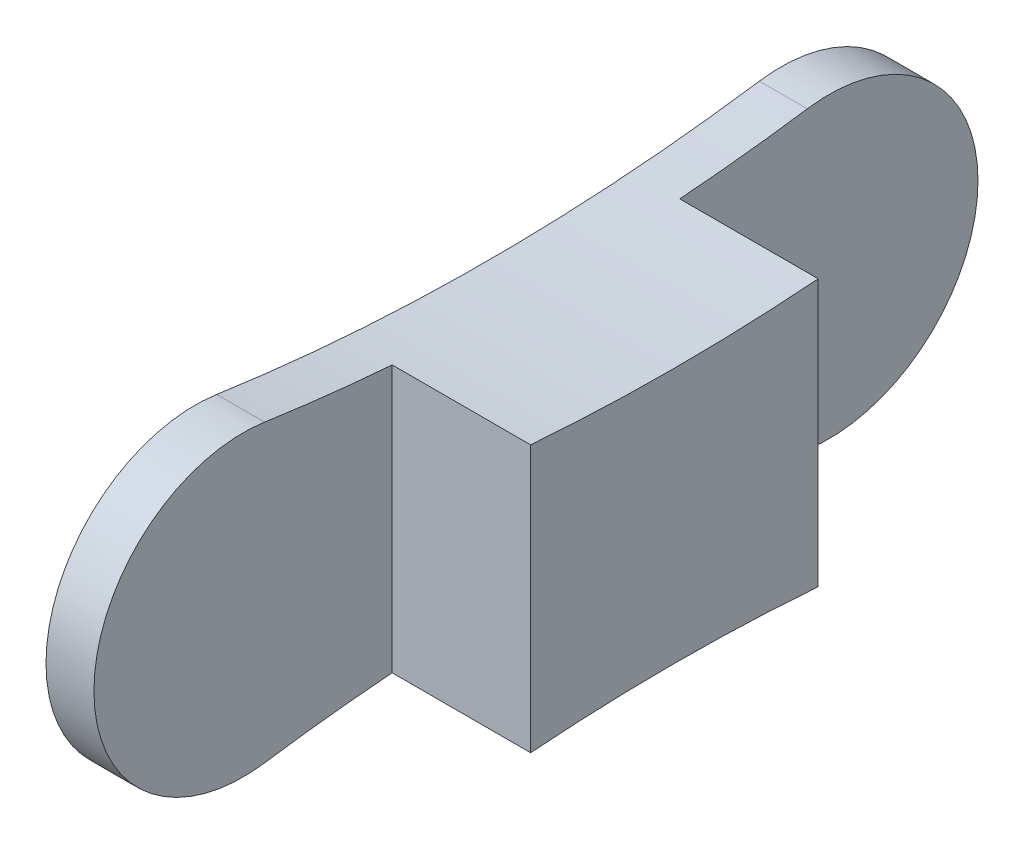
ISO-10303-21;
HEADER;
FILE_DESCRIPTION(('STEP AP214'),'2;1');
FILE_NAME('part.step','',(''),(''),'','','');
FILE_SCHEMA(('AUTOMOTIVE_DESIGN { 1 0 10303 214 1 1 1 1 }'));
ENDSEC;
DATA;
#1=APPLICATION_CONTEXT('core data for automotive mechanical design processes');
#2=APPLICATION_PROTOCOL_DEFINITION('international standard','automotive_design',2000,#1);
#3=PRODUCT_CONTEXT('',#1,'mechanical');
#4=PRODUCT('Part','Part','',(#3));
#5=PRODUCT_RELATED_PRODUCT_CATEGORY('part','',(#4));
#6=PRODUCT_DEFINITION_FORMATION('','',#4);
#7=PRODUCT_DEFINITION_CONTEXT('part definition',#1,'design');
#8=PRODUCT_DEFINITION('design','',#6,#7);
#9=PRODUCT_DEFINITION_SHAPE('','',#8);
#10=(LENGTH_UNIT() NAMED_UNIT(*) SI_UNIT(.MILLI.,.METRE.));
#11=(NAMED_UNIT(*) PLANE_ANGLE_UNIT() SI_UNIT($,.RADIAN.));
#12=(NAMED_UNIT(*) SI_UNIT($,.STERADIAN.) SOLID_ANGLE_UNIT());
#13=UNCERTAINTY_MEASURE_WITH_UNIT(LENGTH_MEASURE(1.E-05),#10,'distance_accuracy_value','');
#14=(GEOMETRIC_REPRESENTATION_CONTEXT(3) GLOBAL_UNCERTAINTY_ASSIGNED_CONTEXT((#13)) GLOBAL_UNIT_ASSIGNED_CONTEXT((#10,
#11,#12)) REPRESENTATION_CONTEXT('',''));
#15=CARTESIAN_POINT('',(0.,0.,0.));
#16=DIRECTION('',(0.,0.,1.));
#17=DIRECTION('',(1.,0.,0.));
#18=AXIS2_PLACEMENT_3D('',#15,#16,#17);
#19=CARTESIAN_POINT('',(35.,0.,0.));
#20=DIRECTION('',(-1.,0.,0.));
#21=DIRECTION('',(0.,0.,1.));
#22=AXIS2_PLACEMENT_3D('',#19,#20,#21);
#23=CYLINDRICAL_SURFACE('',#22,28.);
#24=DIRECTION('',(-1.,0.,0.));
#25=VECTOR('',#24,1.);
#26=CARTESIAN_POINT('',(35.,27.7053600789214,4.05129891483066));
#27=LINE('',#26,#25);
#28=CARTESIAN_POINT('',(9.,27.7053600789214,4.05129891483066));
#29=VERTEX_POINT('',#28);
#30=CARTESIAN_POINT('',(0.,27.7053600789214,4.05129891483066));
#31=VERTEX_POINT('',#30);
#32=EDGE_CURVE('E182',#29,#31,#27,.T.);
#33=ORIENTED_EDGE('',*,*,#32,.F.);
#34=CARTESIAN_POINT('',(9.,0.,0.));
#35=DIRECTION('',(-1.,0.,0.));
#36=DIRECTION('',(0.,0.,1.));
#37=AXIS2_PLACEMENT_3D('',#34,#35,#36);
#38=CIRCLE('',#37,28.);
#39=CARTESIAN_POINT('',(9.,-27.7053600789214,4.05129891483066));
#40=VERTEX_POINT('',#39);
#41=EDGE_CURVE('E145',#29,#40,#38,.T.);
#42=ORIENTED_EDGE('',*,*,#41,.T.);
#43=DIRECTION('',(-1.,0.,0.));
#44=VECTOR('',#43,1.);
#45=CARTESIAN_POINT('',(35.,-27.7053600789214,4.05129891483066));
#46=LINE('',#45,#44);
#47=CARTESIAN_POINT('',(0.,-27.7053600789214,4.05129891483066));
#48=VERTEX_POINT('',#47);
#49=EDGE_CURVE('E159',#40,#48,#46,.T.);
#50=ORIENTED_EDGE('',*,*,#49,.T.);
#51=CARTESIAN_POINT('',(0.,0.,0.));
#52=DIRECTION('',(1.,0.,0.));
#53=DIRECTION('',(0.,0.,-1.));
#54=AXIS2_PLACEMENT_3D('',#51,#52,#53);
#55=CIRCLE('',#54,28.);
#56=EDGE_CURVE('E151',#48,#31,#55,.T.);
#57=ORIENTED_EDGE('',*,*,#56,.T.);
#58=EDGE_LOOP('',(#33,#42,#50,#57));
#59=FACE_BOUND('',#58,.T.);
#60=ADVANCED_FACE('F41',(#59),#23,.T.);
#61=CARTESIAN_POINT('',(35.,376.124999999999,55.));
#62=DIRECTION('',(-1.,0.,0.));
#63=DIRECTION('',(0.,0.,1.));
#64=AXIS2_PLACEMENT_3D('',#61,#62,#63);
#65=CYLINDRICAL_SURFACE('',#64,352.124999999999);
#66=DIRECTION('',(-1.,0.,0.));
#67=VECTOR('',#66,1.);
#68=CARTESIAN_POINT('',(35.,25.0366697681337,28.));
#69=LINE('',#68,#67);
#70=CARTESIAN_POINT('',(9.00000000000001,25.0366697681337,28.));
#71=VERTEX_POINT('',#70);
#72=CARTESIAN_POINT('',(35.,25.0366697681337,28.));
#73=VERTEX_POINT('',#72);
#74=EDGE_CURVE('E64',#71,#73,#69,.F.);
#75=ORIENTED_EDGE('',*,*,#74,.F.);
#76=CARTESIAN_POINT('',(9.00000000000001,376.124999999999,55.));
#77=DIRECTION('',(-1.,0.,0.));
#78=DIRECTION('',(0.,0.,1.));
#79=AXIS2_PLACEMENT_3D('',#76,#77,#78);
#80=CIRCLE('',#79,352.124999999999);
#81=EDGE_CURVE('E148',#29,#71,#80,.T.);
#82=ORIENTED_EDGE('',*,*,#81,.F.);
#83=ORIENTED_EDGE('',*,*,#32,.T.);
#84=CARTESIAN_POINT('',(0.,376.124999999999,55.));
#85=DIRECTION('',(1.,0.,0.));
#86=DIRECTION('',(0.,0.,-1.));
#87=AXIS2_PLACEMENT_3D('',#84,#85,#86);
#88=CIRCLE('',#87,352.124999999999);
#89=CARTESIAN_POINT('',(0.,27.7053600789214,105.948701085169));
#90=VERTEX_POINT('',#89);
#91=EDGE_CURVE('E163',#90,#31,#88,.T.);
#92=ORIENTED_EDGE('',*,*,#91,.F.);
#93=DIRECTION('',(-1.,0.,0.));
#94=VECTOR('',#93,1.);
#95=CARTESIAN_POINT('',(35.,27.7053600789214,105.948701085169));
#96=LINE('',#95,#94);
#97=CARTESIAN_POINT('',(8.99999999999994,27.7053600789214,105.948701085169));
#98=VERTEX_POINT('',#97);
#99=EDGE_CURVE('E179',#98,#90,#96,.T.);
#100=ORIENTED_EDGE('',*,*,#99,.F.);
#101=CARTESIAN_POINT('',(8.99999999999995,376.124999999999,55.));
#102=DIRECTION('',(-1.,0.,0.));
#103=DIRECTION('',(0.,0.,1.));
#104=AXIS2_PLACEMENT_3D('',#101,#102,#103);
#105=CIRCLE('',#104,352.124999999999);
#106=CARTESIAN_POINT('',(8.99999999999995,25.0366697681337,82.));
#107=VERTEX_POINT('',#106);
#108=EDGE_CURVE('E142',#107,#98,#105,.T.);
#109=ORIENTED_EDGE('',*,*,#108,.F.);
#110=DIRECTION('',(-1.,0.,0.));
#111=VECTOR('',#110,1.);
#112=CARTESIAN_POINT('',(35.,25.0366697681337,82.));
#113=LINE('',#112,#111);
#114=CARTESIAN_POINT('',(35.,25.0366697681337,82.));
#115=VERTEX_POINT('',#114);
#116=EDGE_CURVE('E119',#115,#107,#113,.T.);
#117=ORIENTED_EDGE('',*,*,#116,.F.);
#118=CARTESIAN_POINT('',(35.,376.124999999999,55.));
#119=DIRECTION('',(1.,0.,0.));
#120=DIRECTION('',(0.,0.,-1.));
#121=AXIS2_PLACEMENT_3D('',#118,#119,#120);
#122=CIRCLE('',#121,352.124999999999);
#123=EDGE_CURVE('E152',#115,#73,#122,.T.);
#124=ORIENTED_EDGE('',*,*,#123,.T.);
#125=EDGE_LOOP('',(#75,#82,#83,#92,#100,#109,#117,#124));
#126=FACE_BOUND('',#125,.T.);
#127=ADVANCED_FACE('F197',(#126),#65,.F.);
#128=CARTESIAN_POINT('',(35.,0.,110.));
#129=DIRECTION('',(-1.,0.,0.));
#130=DIRECTION('',(0.,0.,1.));
#131=AXIS2_PLACEMENT_3D('',#128,#129,#130);
#132=CYLINDRICAL_SURFACE('',#131,28.);
#133=DIRECTION('',(-1.,0.,0.));
#134=VECTOR('',#133,1.);
#135=CARTESIAN_POINT('',(35.,-27.7053600789214,105.948701085169));
#136=LINE('',#135,#134);
#137=CARTESIAN_POINT('',(8.99999999999994,-27.7053600789214,105.948701085169));
#138=VERTEX_POINT('',#137);
#139=CARTESIAN_POINT('',(0.,-27.7053600789214,105.948701085169));
#140=VERTEX_POINT('',#139);
#141=EDGE_CURVE('E176',#138,#140,#136,.T.);
#142=ORIENTED_EDGE('',*,*,#141,.F.);
#143=CARTESIAN_POINT('',(8.99999999999994,0.,110.));
#144=DIRECTION('',(-1.,0.,0.));
#145=DIRECTION('',(0.,0.,1.));
#146=AXIS2_PLACEMENT_3D('',#143,#144,#145);
#147=CIRCLE('',#146,28.);
#148=EDGE_CURVE('E112',#138,#98,#147,.T.);
#149=ORIENTED_EDGE('',*,*,#148,.T.);
#150=ORIENTED_EDGE('',*,*,#99,.T.);
#151=CARTESIAN_POINT('',(0.,0.,110.));
#152=DIRECTION('',(1.,0.,0.));
#153=DIRECTION('',(0.,0.,-1.));
#154=AXIS2_PLACEMENT_3D('',#151,#152,#153);
#155=CIRCLE('',#154,28.);
#156=EDGE_CURVE('E167',#90,#140,#155,.T.);
#157=ORIENTED_EDGE('',*,*,#156,.T.);
#158=EDGE_LOOP('',(#142,#149,#150,#157));
#159=FACE_BOUND('',#158,.T.);
#160=ADVANCED_FACE('F202',(#159),#132,.T.);
#161=CARTESIAN_POINT('',(35.,-376.124999999999,55.));
#162=DIRECTION('',(-1.,0.,0.));
#163=DIRECTION('',(0.,0.,1.));
#164=AXIS2_PLACEMENT_3D('',#161,#162,#163);
#165=CYLINDRICAL_SURFACE('',#164,352.124999999999);
#166=CARTESIAN_POINT('',(9.00000000000001,-376.124999999999,55.));
#167=DIRECTION('',(-1.,0.,0.));
#168=DIRECTION('',(0.,0.,1.));
#169=AXIS2_PLACEMENT_3D('',#166,#167,#168);
#170=CIRCLE('',#169,352.124999999999);
#171=CARTESIAN_POINT('',(9.00000000000001,-25.0366697681337,28.));
#172=VERTEX_POINT('',#171);
#173=EDGE_CURVE('E11',#40,#172,#170,.F.);
#174=ORIENTED_EDGE('',*,*,#173,.T.);
#175=DIRECTION('',(-1.,0.,0.));
#176=VECTOR('',#175,1.);
#177=CARTESIAN_POINT('',(35.,-25.0366697681337,28.));
#178=LINE('',#177,#176);
#179=CARTESIAN_POINT('',(35.,-25.0366697681337,28.));
#180=VERTEX_POINT('',#179);
#181=EDGE_CURVE('E132',#172,#180,#178,.F.);
#182=ORIENTED_EDGE('',*,*,#181,.T.);
#183=CARTESIAN_POINT('',(35.,-376.124999999999,55.));
#184=DIRECTION('',(1.,0.,0.));
#185=DIRECTION('',(0.,0.,-1.));
#186=AXIS2_PLACEMENT_3D('',#183,#184,#185);
#187=CIRCLE('',#186,352.124999999999);
#188=CARTESIAN_POINT('',(35.,-25.0366697681337,82.));
#189=VERTEX_POINT('',#188);
#190=EDGE_CURVE('E127',#189,#180,#187,.F.);
#191=ORIENTED_EDGE('',*,*,#190,.F.);
#192=DIRECTION('',(-1.,0.,0.));
#193=VECTOR('',#192,1.);
#194=CARTESIAN_POINT('',(35.,-25.0366697681337,82.));
#195=LINE('',#194,#193);
#196=CARTESIAN_POINT('',(8.99999999999995,-25.0366697681337,82.));
#197=VERTEX_POINT('',#196);
#198=EDGE_CURVE('E56',#189,#197,#195,.T.);
#199=ORIENTED_EDGE('',*,*,#198,.T.);
#200=CARTESIAN_POINT('',(8.99999999999995,-376.124999999999,55.));
#201=DIRECTION('',(-1.,0.,0.));
#202=DIRECTION('',(0.,0.,1.));
#203=AXIS2_PLACEMENT_3D('',#200,#201,#202);
#204=CIRCLE('',#203,352.124999999999);
#205=EDGE_CURVE('E49',#197,#138,#204,.F.);
#206=ORIENTED_EDGE('',*,*,#205,.T.);
#207=ORIENTED_EDGE('',*,*,#141,.T.);
#208=CARTESIAN_POINT('',(0.,-376.124999999999,55.));
#209=DIRECTION('',(1.,0.,0.));
#210=DIRECTION('',(0.,0.,-1.));
#211=AXIS2_PLACEMENT_3D('',#208,#209,#210);
#212=CIRCLE('',#211,352.124999999999);
#213=EDGE_CURVE('E156',#140,#48,#212,.F.);
#214=ORIENTED_EDGE('',*,*,#213,.T.);
#215=ORIENTED_EDGE('',*,*,#49,.F.);
#216=EDGE_LOOP('',(#174,#182,#191,#199,#206,#207,#214,#215));
#217=FACE_BOUND('',#216,.T.);
#218=ADVANCED_FACE('F124',(#217),#165,.F.);
#219=CARTESIAN_POINT('',(35.,0.,0.));
#220=DIRECTION('',(1.,0.,0.));
#221=DIRECTION('',(0.,0.,-1.));
#222=AXIS2_PLACEMENT_3D('',#219,#220,#221);
#223=PLANE('',#222);
#224=DIRECTION('',(0.,-1.,0.));
#225=VECTOR('',#224,1.);
#226=CARTESIAN_POINT('',(35.,0.,28.));
#227=LINE('',#226,#225);
#228=EDGE_CURVE('E116',#73,#180,#227,.T.);
#229=ORIENTED_EDGE('',*,*,#228,.F.);
#230=ORIENTED_EDGE('',*,*,#123,.F.);
#231=DIRECTION('',(0.,1.,0.));
#232=VECTOR('',#231,1.);
#233=CARTESIAN_POINT('',(35.,0.,82.));
#234=LINE('',#233,#232);
#235=EDGE_CURVE('E185',#189,#115,#234,.T.);
#236=ORIENTED_EDGE('',*,*,#235,.F.);
#237=ORIENTED_EDGE('',*,*,#190,.T.);
#238=EDGE_LOOP('',(#229,#230,#236,#237));
#239=FACE_BOUND('',#238,.T.);
#240=ADVANCED_FACE('F195',(#239),#223,.T.);
#241=CARTESIAN_POINT('',(0.,0.,0.));
#242=DIRECTION('',(1.,0.,0.));
#243=DIRECTION('',(0.,0.,-1.));
#244=AXIS2_PLACEMENT_3D('',#241,#242,#243);
#245=PLANE('',#244);
#246=ORIENTED_EDGE('',*,*,#56,.F.);
#247=ORIENTED_EDGE('',*,*,#213,.F.);
#248=ORIENTED_EDGE('',*,*,#156,.F.);
#249=ORIENTED_EDGE('',*,*,#91,.T.);
#250=EDGE_LOOP('',(#246,#247,#248,#249));
#251=FACE_BOUND('',#250,.T.);
#252=ADVANCED_FACE('F206',(#251),#245,.F.);
#253=CARTESIAN_POINT('',(8.99999999999994,-28.,138.));
#254=DIRECTION('',(-1.,0.,0.));
#255=DIRECTION('',(0.,0.,1.));
#256=AXIS2_PLACEMENT_3D('',#253,#254,#255);
#257=PLANE('',#256);
#258=ORIENTED_EDGE('',*,*,#108,.T.);
#259=ORIENTED_EDGE('',*,*,#148,.F.);
#260=ORIENTED_EDGE('',*,*,#205,.F.);
#261=DIRECTION('',(0.,1.,0.));
#262=VECTOR('',#261,1.);
#263=CARTESIAN_POINT('',(8.99999999999995,-28.,82.));
#264=LINE('',#263,#262);
#265=EDGE_CURVE('E110',#197,#107,#264,.T.);
#266=ORIENTED_EDGE('',*,*,#265,.T.);
#267=EDGE_LOOP('',(#258,#259,#260,#266));
#268=FACE_BOUND('',#267,.T.);
#269=ADVANCED_FACE('F109',(#268),#257,.F.);
#270=CARTESIAN_POINT('',(8.99999999999995,-28.,82.));
#271=DIRECTION('',(0.,0.,-1.));
#272=DIRECTION('',(-1.,0.,0.));
#273=AXIS2_PLACEMENT_3D('',#270,#271,#272);
#274=PLANE('',#273);
#275=ORIENTED_EDGE('',*,*,#116,.T.);
#276=ORIENTED_EDGE('',*,*,#265,.F.);
#277=ORIENTED_EDGE('',*,*,#198,.F.);
#278=ORIENTED_EDGE('',*,*,#235,.T.);
#279=EDGE_LOOP('',(#275,#276,#277,#278));
#280=FACE_BOUND('',#279,.T.);
#281=ADVANCED_FACE('F117',(#280),#274,.F.);
#282=CARTESIAN_POINT('',(9.,-28.,-28.));
#283=DIRECTION('',(-1.,0.,0.));
#284=DIRECTION('',(0.,0.,1.));
#285=AXIS2_PLACEMENT_3D('',#282,#283,#284);
#286=PLANE('',#285);
#287=ORIENTED_EDGE('',*,*,#81,.T.);
#288=DIRECTION('',(0.,1.,0.));
#289=VECTOR('',#288,1.);
#290=CARTESIAN_POINT('',(9.00000000000001,-28.,28.));
#291=LINE('',#290,#289);
#292=EDGE_CURVE('E121',#172,#71,#291,.T.);
#293=ORIENTED_EDGE('',*,*,#292,.F.);
#294=ORIENTED_EDGE('',*,*,#173,.F.);
#295=ORIENTED_EDGE('',*,*,#41,.F.);
#296=EDGE_LOOP('',(#287,#293,#294,#295));
#297=FACE_BOUND('',#296,.T.);
#298=ADVANCED_FACE('F211',(#297),#286,.F.);
#299=CARTESIAN_POINT('',(9.00000000000001,-28.,28.));
#300=DIRECTION('',(0.,0.,1.));
#301=DIRECTION('',(1.,0.,0.));
#302=AXIS2_PLACEMENT_3D('',#299,#300,#301);
#303=PLANE('',#302);
#304=ORIENTED_EDGE('',*,*,#74,.T.);
#305=ORIENTED_EDGE('',*,*,#228,.T.);
#306=ORIENTED_EDGE('',*,*,#181,.F.);
#307=ORIENTED_EDGE('',*,*,#292,.T.);
#308=EDGE_LOOP('',(#304,#305,#306,#307));
#309=FACE_BOUND('',#308,.T.);
#310=ADVANCED_FACE('F189',(#309),#303,.F.);
#311=CLOSED_SHELL('',(#60,#127,#160,#218,#240,#252,#269,#281,#298,#310));
#312=MANIFOLD_SOLID_BREP('B2',#311);
#313=ADVANCED_BREP_SHAPE_REPRESENTATION('',(#18,#312),#14);
#314=SHAPE_DEFINITION_REPRESENTATION(#9,#313);
ENDSEC;
END-ISO-10303-21;
